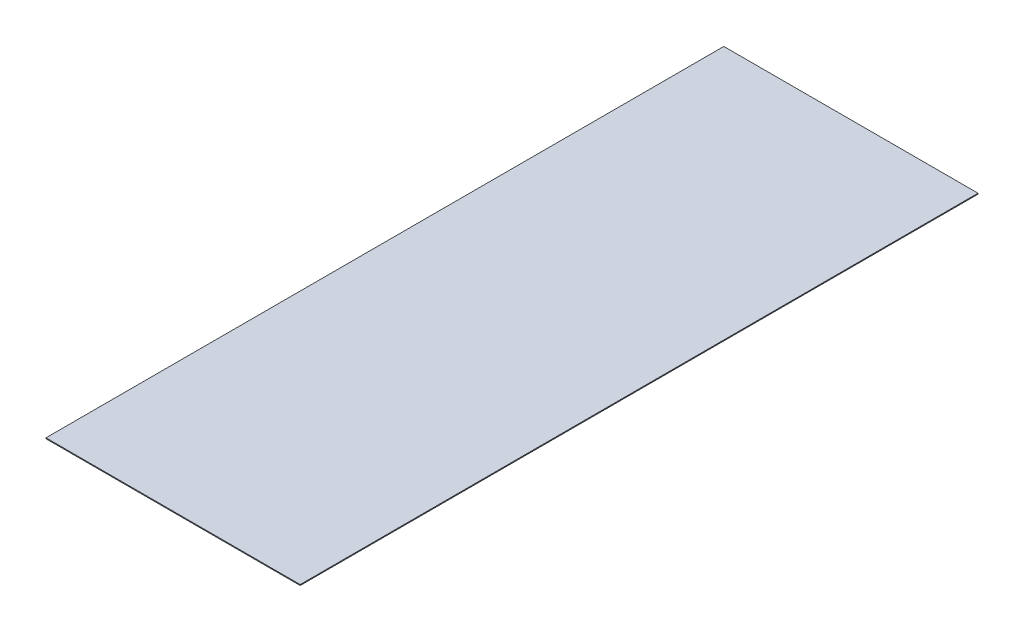
ISO-10303-21;
HEADER;
FILE_DESCRIPTION(('STEP AP214'),'2;1');
FILE_NAME('part.step','',(''),(''),'','','');
FILE_SCHEMA(('AUTOMOTIVE_DESIGN { 1 0 10303 214 1 1 1 1 }'));
ENDSEC;
DATA;
#1=APPLICATION_CONTEXT('core data for automotive mechanical design processes');
#2=APPLICATION_PROTOCOL_DEFINITION('international standard','automotive_design',2000,#1);
#3=PRODUCT_CONTEXT('',#1,'mechanical');
#4=PRODUCT('Part','Part','',(#3));
#5=PRODUCT_RELATED_PRODUCT_CATEGORY('part','',(#4));
#6=PRODUCT_DEFINITION_FORMATION('','',#4);
#7=PRODUCT_DEFINITION_CONTEXT('part definition',#1,'design');
#8=PRODUCT_DEFINITION('design','',#6,#7);
#9=PRODUCT_DEFINITION_SHAPE('','',#8);
#10=(LENGTH_UNIT() NAMED_UNIT(*) SI_UNIT(.MILLI.,.METRE.));
#11=(NAMED_UNIT(*) PLANE_ANGLE_UNIT() SI_UNIT($,.RADIAN.));
#12=(NAMED_UNIT(*) SI_UNIT($,.STERADIAN.) SOLID_ANGLE_UNIT());
#13=UNCERTAINTY_MEASURE_WITH_UNIT(LENGTH_MEASURE(1.E-05),#10,'distance_accuracy_value','');
#14=(GEOMETRIC_REPRESENTATION_CONTEXT(3) GLOBAL_UNCERTAINTY_ASSIGNED_CONTEXT((#13)) GLOBAL_UNIT_ASSIGNED_CONTEXT((#10,
#11,#12)) REPRESENTATION_CONTEXT('',''));
#15=CARTESIAN_POINT('',(0.,0.,0.));
#16=DIRECTION('',(0.,0.,1.));
#17=DIRECTION('',(1.,0.,0.));
#18=AXIS2_PLACEMENT_3D('',#15,#16,#17);
#19=CARTESIAN_POINT('',(457.2,3.2,1219.2));
#20=DIRECTION('',(-1.,0.,0.));
#21=DIRECTION('',(0.,0.,1.));
#22=AXIS2_PLACEMENT_3D('',#19,#20,#21);
#23=PLANE('',#22);
#24=DIRECTION('',(0.,0.,-1.));
#25=VECTOR('',#24,1.);
#26=CARTESIAN_POINT('',(457.2,0.,1219.2));
#27=LINE('',#26,#25);
#28=CARTESIAN_POINT('',(457.2,0.,1219.2));
#29=VERTEX_POINT('',#28);
#30=CARTESIAN_POINT('',(457.2,0.,-1219.2));
#31=VERTEX_POINT('',#30);
#32=EDGE_CURVE('E96',#29,#31,#27,.T.);
#33=ORIENTED_EDGE('',*,*,#32,.T.);
#34=DIRECTION('',(0.,-1.,0.));
#35=VECTOR('',#34,1.);
#36=CARTESIAN_POINT('',(457.2,3.2,-1219.2));
#37=LINE('',#36,#35);
#38=CARTESIAN_POINT('',(457.2,3.2,-1219.2));
#39=VERTEX_POINT('',#38);
#40=EDGE_CURVE('E11',#39,#31,#37,.T.);
#41=ORIENTED_EDGE('',*,*,#40,.F.);
#42=DIRECTION('',(0.,0.,-1.));
#43=VECTOR('',#42,1.);
#44=CARTESIAN_POINT('',(457.2,3.2,1219.2));
#45=LINE('',#44,#43);
#46=CARTESIAN_POINT('',(457.2,3.2,1219.2));
#47=VERTEX_POINT('',#46);
#48=EDGE_CURVE('E84',#47,#39,#45,.T.);
#49=ORIENTED_EDGE('',*,*,#48,.F.);
#50=DIRECTION('',(0.,-1.,0.));
#51=VECTOR('',#50,1.);
#52=CARTESIAN_POINT('',(457.2,3.2,1219.2));
#53=LINE('',#52,#51);
#54=EDGE_CURVE('E92',#47,#29,#53,.T.);
#55=ORIENTED_EDGE('',*,*,#54,.T.);
#56=EDGE_LOOP('',(#33,#41,#49,#55));
#57=FACE_BOUND('',#56,.T.);
#58=ADVANCED_FACE('F33',(#57),#23,.F.);
#59=CARTESIAN_POINT('',(-457.2,3.2,-1219.2));
#60=DIRECTION('',(0.,0.,1.));
#61=DIRECTION('',(1.,0.,0.));
#62=AXIS2_PLACEMENT_3D('',#59,#60,#61);
#63=PLANE('',#62);
#64=DIRECTION('',(-1.,0.,0.));
#65=VECTOR('',#64,1.);
#66=CARTESIAN_POINT('',(-457.2,0.,-1219.2));
#67=LINE('',#66,#65);
#68=CARTESIAN_POINT('',(-457.2,0.,-1219.2));
#69=VERTEX_POINT('',#68);
#70=EDGE_CURVE('E88',#31,#69,#67,.T.);
#71=ORIENTED_EDGE('',*,*,#70,.T.);
#72=DIRECTION('',(0.,-1.,0.));
#73=VECTOR('',#72,1.);
#74=CARTESIAN_POINT('',(-457.2,3.2,-1219.2));
#75=LINE('',#74,#73);
#76=CARTESIAN_POINT('',(-457.2,3.2,-1219.2));
#77=VERTEX_POINT('',#76);
#78=EDGE_CURVE('E41',#77,#69,#75,.T.);
#79=ORIENTED_EDGE('',*,*,#78,.F.);
#80=DIRECTION('',(-1.,0.,0.));
#81=VECTOR('',#80,1.);
#82=CARTESIAN_POINT('',(-457.2,3.2,-1219.2));
#83=LINE('',#82,#81);
#84=EDGE_CURVE('E79',#39,#77,#83,.T.);
#85=ORIENTED_EDGE('',*,*,#84,.F.);
#86=ORIENTED_EDGE('',*,*,#40,.T.);
#87=EDGE_LOOP('',(#71,#79,#85,#86));
#88=FACE_BOUND('',#87,.T.);
#89=ADVANCED_FACE('F87',(#88),#63,.F.);
#90=CARTESIAN_POINT('',(-457.2,3.2,1219.2));
#91=DIRECTION('',(1.,0.,0.));
#92=DIRECTION('',(0.,0.,-1.));
#93=AXIS2_PLACEMENT_3D('',#90,#91,#92);
#94=PLANE('',#93);
#95=DIRECTION('',(0.,0.,1.));
#96=VECTOR('',#95,1.);
#97=CARTESIAN_POINT('',(-457.2,0.,1219.2));
#98=LINE('',#97,#96);
#99=CARTESIAN_POINT('',(-457.2,0.,1219.2));
#100=VERTEX_POINT('',#99);
#101=EDGE_CURVE('E66',#69,#100,#98,.T.);
#102=ORIENTED_EDGE('',*,*,#101,.T.);
#103=DIRECTION('',(0.,-1.,0.));
#104=VECTOR('',#103,1.);
#105=CARTESIAN_POINT('',(-457.2,3.2,1219.2));
#106=LINE('',#105,#104);
#107=CARTESIAN_POINT('',(-457.2,3.2,1219.2));
#108=VERTEX_POINT('',#107);
#109=EDGE_CURVE('E89',#108,#100,#106,.T.);
#110=ORIENTED_EDGE('',*,*,#109,.F.);
#111=DIRECTION('',(0.,0.,1.));
#112=VECTOR('',#111,1.);
#113=CARTESIAN_POINT('',(-457.2,3.2,1219.2));
#114=LINE('',#113,#112);
#115=EDGE_CURVE('E82',#77,#108,#114,.T.);
#116=ORIENTED_EDGE('',*,*,#115,.F.);
#117=ORIENTED_EDGE('',*,*,#78,.T.);
#118=EDGE_LOOP('',(#102,#110,#116,#117));
#119=FACE_BOUND('',#118,.T.);
#120=ADVANCED_FACE('F90',(#119),#94,.F.);
#121=CARTESIAN_POINT('',(-457.2,3.2,1219.2));
#122=DIRECTION('',(0.,0.,-1.));
#123=DIRECTION('',(-1.,0.,0.));
#124=AXIS2_PLACEMENT_3D('',#121,#122,#123);
#125=PLANE('',#124);
#126=DIRECTION('',(1.,0.,0.));
#127=VECTOR('',#126,1.);
#128=CARTESIAN_POINT('',(-457.2,0.,1219.2));
#129=LINE('',#128,#127);
#130=EDGE_CURVE('E72',#100,#29,#129,.T.);
#131=ORIENTED_EDGE('',*,*,#130,.T.);
#132=ORIENTED_EDGE('',*,*,#54,.F.);
#133=DIRECTION('',(1.,0.,0.));
#134=VECTOR('',#133,1.);
#135=CARTESIAN_POINT('',(-457.2,3.2,1219.2));
#136=LINE('',#135,#134);
#137=EDGE_CURVE('E49',#108,#47,#136,.T.);
#138=ORIENTED_EDGE('',*,*,#137,.F.);
#139=ORIENTED_EDGE('',*,*,#109,.T.);
#140=EDGE_LOOP('',(#131,#132,#138,#139));
#141=FACE_BOUND('',#140,.T.);
#142=ADVANCED_FACE('F103',(#141),#125,.F.);
#143=CARTESIAN_POINT('',(0.,3.2,0.));
#144=DIRECTION('',(0.,-1.,0.));
#145=DIRECTION('',(0.,0.,-1.));
#146=AXIS2_PLACEMENT_3D('',#143,#144,#145);
#147=PLANE('',#146);
#148=ORIENTED_EDGE('',*,*,#48,.T.);
#149=ORIENTED_EDGE('',*,*,#84,.T.);
#150=ORIENTED_EDGE('',*,*,#115,.T.);
#151=ORIENTED_EDGE('',*,*,#137,.T.);
#152=EDGE_LOOP('',(#148,#149,#150,#151));
#153=FACE_BOUND('',#152,.T.);
#154=ADVANCED_FACE('F80',(#153),#147,.F.);
#155=CARTESIAN_POINT('',(0.,0.,0.));
#156=DIRECTION('',(0.,-1.,0.));
#157=DIRECTION('',(0.,0.,-1.));
#158=AXIS2_PLACEMENT_3D('',#155,#156,#157);
#159=PLANE('',#158);
#160=ORIENTED_EDGE('',*,*,#32,.F.);
#161=ORIENTED_EDGE('',*,*,#130,.F.);
#162=ORIENTED_EDGE('',*,*,#101,.F.);
#163=ORIENTED_EDGE('',*,*,#70,.F.);
#164=EDGE_LOOP('',(#160,#161,#162,#163));
#165=FACE_BOUND('',#164,.T.);
#166=ADVANCED_FACE('F106',(#165),#159,.T.);
#167=CLOSED_SHELL('',(#58,#89,#120,#142,#154,#166));
#168=MANIFOLD_SOLID_BREP('B2',#167);
#169=ADVANCED_BREP_SHAPE_REPRESENTATION('',(#18,#168),#14);
#170=SHAPE_DEFINITION_REPRESENTATION(#9,#169);
ENDSEC;
END-ISO-10303-21;
